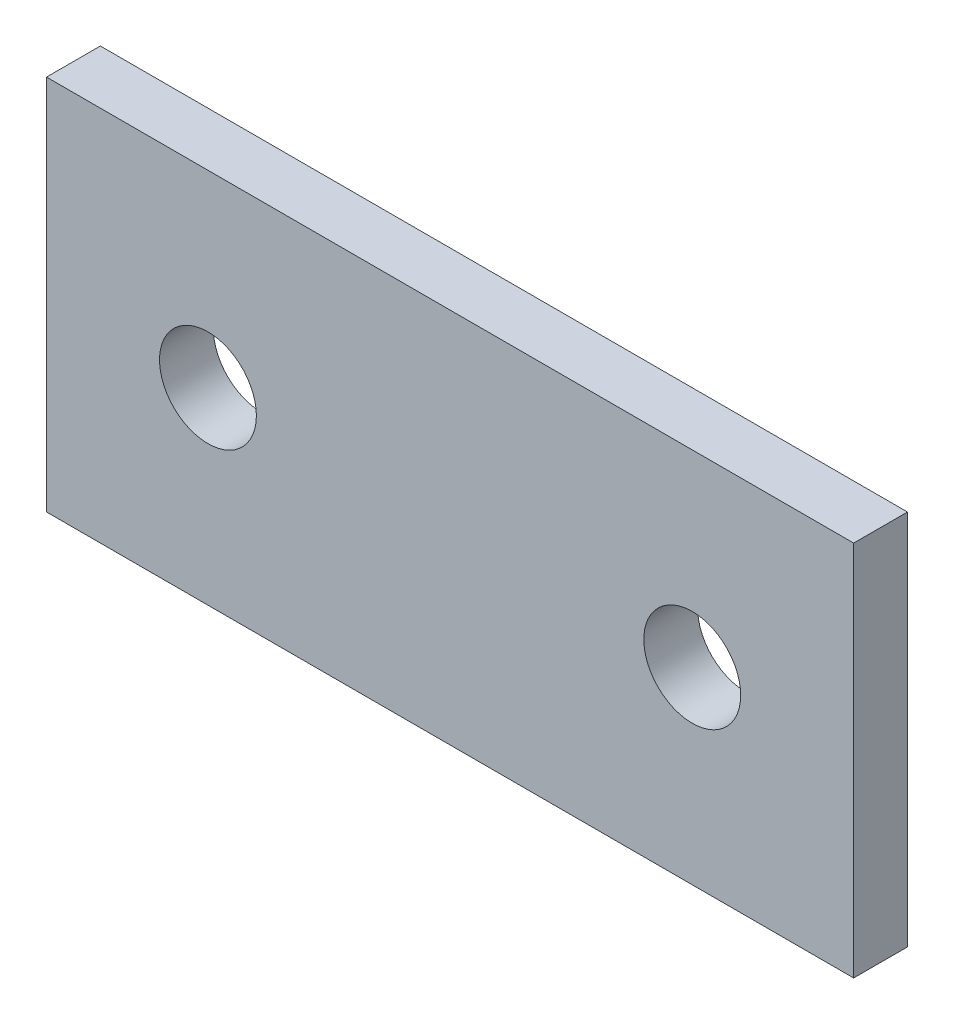
ISO-10303-21;
HEADER;
FILE_DESCRIPTION(('STEP AP214'),'2;1');
FILE_NAME('part.step','',(''),(''),'','','');
FILE_SCHEMA(('AUTOMOTIVE_DESIGN { 1 0 10303 214 1 1 1 1 }'));
ENDSEC;
DATA;
#1=APPLICATION_CONTEXT('core data for automotive mechanical design processes');
#2=APPLICATION_PROTOCOL_DEFINITION('international standard','automotive_design',2000,#1);
#3=PRODUCT_CONTEXT('',#1,'mechanical');
#4=PRODUCT('Part','Part','',(#3));
#5=PRODUCT_RELATED_PRODUCT_CATEGORY('part','',(#4));
#6=PRODUCT_DEFINITION_FORMATION('','',#4);
#7=PRODUCT_DEFINITION_CONTEXT('part definition',#1,'design');
#8=PRODUCT_DEFINITION('design','',#6,#7);
#9=PRODUCT_DEFINITION_SHAPE('','',#8);
#10=(LENGTH_UNIT() NAMED_UNIT(*) SI_UNIT(.MILLI.,.METRE.));
#11=(NAMED_UNIT(*) PLANE_ANGLE_UNIT() SI_UNIT($,.RADIAN.));
#12=(NAMED_UNIT(*) SI_UNIT($,.STERADIAN.) SOLID_ANGLE_UNIT());
#13=UNCERTAINTY_MEASURE_WITH_UNIT(LENGTH_MEASURE(1.E-05),#10,'distance_accuracy_value','');
#14=(GEOMETRIC_REPRESENTATION_CONTEXT(3) GLOBAL_UNCERTAINTY_ASSIGNED_CONTEXT((#13)) GLOBAL_UNIT_ASSIGNED_CONTEXT((#10,
#11,#12)) REPRESENTATION_CONTEXT('',''));
#15=CARTESIAN_POINT('',(0.,0.,0.));
#16=DIRECTION('',(0.,0.,1.));
#17=DIRECTION('',(1.,0.,0.));
#18=AXIS2_PLACEMENT_3D('',#15,#16,#17);
#19=CARTESIAN_POINT('',(0.,0.,5.));
#20=DIRECTION('',(0.,0.,1.));
#21=DIRECTION('',(1.,0.,0.));
#22=AXIS2_PLACEMENT_3D('',#19,#20,#21);
#23=PLANE('',#22);
#24=CARTESIAN_POINT('',(45.,0.,5.));
#25=DIRECTION('',(0.,0.,1.));
#26=DIRECTION('',(1.,0.,0.));
#27=AXIS2_PLACEMENT_3D('',#24,#25,#26);
#28=CIRCLE('',#27,9.);
#29=CARTESIAN_POINT('',(54.,0.,5.));
#30=VERTEX_POINT('',#29);
#31=EDGE_CURVE('E102',#30,#30,#28,.T.);
#32=ORIENTED_EDGE('',*,*,#31,.F.);
#33=EDGE_LOOP('',(#32));
#34=FACE_BOUND('',#33,.T.);
#35=DIRECTION('',(0.,1.,0.));
#36=VECTOR('',#35,1.);
#37=CARTESIAN_POINT('',(75.,35.,5.));
#38=LINE('',#37,#36);
#39=CARTESIAN_POINT('',(75.,-35.,5.));
#40=VERTEX_POINT('',#39);
#41=CARTESIAN_POINT('',(75.,35.,5.));
#42=VERTEX_POINT('',#41);
#43=EDGE_CURVE('E87',#40,#42,#38,.T.);
#44=ORIENTED_EDGE('',*,*,#43,.T.);
#45=DIRECTION('',(-1.,0.,0.));
#46=VECTOR('',#45,1.);
#47=CARTESIAN_POINT('',(-75.,35.,5.));
#48=LINE('',#47,#46);
#49=CARTESIAN_POINT('',(-75.,35.,5.));
#50=VERTEX_POINT('',#49);
#51=EDGE_CURVE('E82',#42,#50,#48,.T.);
#52=ORIENTED_EDGE('',*,*,#51,.T.);
#53=DIRECTION('',(0.,-1.,0.));
#54=VECTOR('',#53,1.);
#55=CARTESIAN_POINT('',(-75.,35.,5.));
#56=LINE('',#55,#54);
#57=CARTESIAN_POINT('',(-75.,-35.,5.));
#58=VERTEX_POINT('',#57);
#59=EDGE_CURVE('E85',#50,#58,#56,.T.);
#60=ORIENTED_EDGE('',*,*,#59,.T.);
#61=DIRECTION('',(1.,0.,0.));
#62=VECTOR('',#61,1.);
#63=CARTESIAN_POINT('',(-75.,-35.,5.));
#64=LINE('',#63,#62);
#65=EDGE_CURVE('E52',#58,#40,#64,.T.);
#66=ORIENTED_EDGE('',*,*,#65,.T.);
#67=EDGE_LOOP('',(#44,#52,#60,#66));
#68=FACE_BOUND('',#67,.T.);
#69=CARTESIAN_POINT('',(-45.,0.,5.));
#70=DIRECTION('',(0.,0.,1.));
#71=DIRECTION('',(1.,0.,0.));
#72=AXIS2_PLACEMENT_3D('',#69,#70,#71);
#73=CIRCLE('',#72,9.);
#74=CARTESIAN_POINT('',(-36.,0.,5.));
#75=VERTEX_POINT('',#74);
#76=EDGE_CURVE('E117',#75,#75,#73,.T.);
#77=ORIENTED_EDGE('',*,*,#76,.F.);
#78=EDGE_LOOP('',(#77));
#79=FACE_BOUND('',#78,.T.);
#80=ADVANCED_FACE('F35',(#34,#68,#79),#23,.T.);
#81=CARTESIAN_POINT('',(0.,0.,-5.));
#82=DIRECTION('',(0.,0.,1.));
#83=DIRECTION('',(1.,0.,0.));
#84=AXIS2_PLACEMENT_3D('',#81,#82,#83);
#85=PLANE('',#84);
#86=DIRECTION('',(0.,1.,0.));
#87=VECTOR('',#86,1.);
#88=CARTESIAN_POINT('',(75.,35.,-5.));
#89=LINE('',#88,#87);
#90=CARTESIAN_POINT('',(75.,-35.,-5.));
#91=VERTEX_POINT('',#90);
#92=CARTESIAN_POINT('',(75.,35.,-5.));
#93=VERTEX_POINT('',#92);
#94=EDGE_CURVE('E99',#91,#93,#89,.T.);
#95=ORIENTED_EDGE('',*,*,#94,.F.);
#96=DIRECTION('',(1.,0.,0.));
#97=VECTOR('',#96,1.);
#98=CARTESIAN_POINT('',(-75.,-35.,-5.));
#99=LINE('',#98,#97);
#100=CARTESIAN_POINT('',(-75.,-35.,-5.));
#101=VERTEX_POINT('',#100);
#102=EDGE_CURVE('E75',#101,#91,#99,.T.);
#103=ORIENTED_EDGE('',*,*,#102,.F.);
#104=DIRECTION('',(0.,-1.,0.));
#105=VECTOR('',#104,1.);
#106=CARTESIAN_POINT('',(-75.,35.,-5.));
#107=LINE('',#106,#105);
#108=CARTESIAN_POINT('',(-75.,35.,-5.));
#109=VERTEX_POINT('',#108);
#110=EDGE_CURVE('E69',#109,#101,#107,.T.);
#111=ORIENTED_EDGE('',*,*,#110,.F.);
#112=DIRECTION('',(-1.,0.,0.));
#113=VECTOR('',#112,1.);
#114=CARTESIAN_POINT('',(-75.,35.,-5.));
#115=LINE('',#114,#113);
#116=EDGE_CURVE('E91',#93,#109,#115,.T.);
#117=ORIENTED_EDGE('',*,*,#116,.F.);
#118=EDGE_LOOP('',(#95,#103,#111,#117));
#119=FACE_BOUND('',#118,.T.);
#120=CARTESIAN_POINT('',(45.,0.,-5.));
#121=DIRECTION('',(0.,0.,1.));
#122=DIRECTION('',(1.,0.,0.));
#123=AXIS2_PLACEMENT_3D('',#120,#121,#122);
#124=CIRCLE('',#123,9.);
#125=CARTESIAN_POINT('',(54.,0.,-5.));
#126=VERTEX_POINT('',#125);
#127=EDGE_CURVE('E114',#126,#126,#124,.T.);
#128=ORIENTED_EDGE('',*,*,#127,.T.);
#129=EDGE_LOOP('',(#128));
#130=FACE_BOUND('',#129,.T.);
#131=CARTESIAN_POINT('',(-45.,0.,-5.));
#132=DIRECTION('',(0.,0.,1.));
#133=DIRECTION('',(1.,0.,0.));
#134=AXIS2_PLACEMENT_3D('',#131,#132,#133);
#135=CIRCLE('',#134,9.);
#136=CARTESIAN_POINT('',(-36.,0.,-5.));
#137=VERTEX_POINT('',#136);
#138=EDGE_CURVE('E120',#137,#137,#135,.T.);
#139=ORIENTED_EDGE('',*,*,#138,.T.);
#140=EDGE_LOOP('',(#139));
#141=FACE_BOUND('',#140,.T.);
#142=ADVANCED_FACE('F110',(#119,#130,#141),#85,.F.);
#143=CARTESIAN_POINT('',(75.,35.,5.));
#144=DIRECTION('',(-1.,0.,0.));
#145=DIRECTION('',(0.,0.,1.));
#146=AXIS2_PLACEMENT_3D('',#143,#144,#145);
#147=PLANE('',#146);
#148=ORIENTED_EDGE('',*,*,#94,.T.);
#149=DIRECTION('',(0.,0.,-1.));
#150=VECTOR('',#149,1.);
#151=CARTESIAN_POINT('',(75.,35.,5.));
#152=LINE('',#151,#150);
#153=EDGE_CURVE('E11',#42,#93,#152,.T.);
#154=ORIENTED_EDGE('',*,*,#153,.F.);
#155=ORIENTED_EDGE('',*,*,#43,.F.);
#156=DIRECTION('',(0.,0.,-1.));
#157=VECTOR('',#156,1.);
#158=CARTESIAN_POINT('',(75.,-35.,5.));
#159=LINE('',#158,#157);
#160=EDGE_CURVE('E95',#40,#91,#159,.T.);
#161=ORIENTED_EDGE('',*,*,#160,.T.);
#162=EDGE_LOOP('',(#148,#154,#155,#161));
#163=FACE_BOUND('',#162,.T.);
#164=ADVANCED_FACE('F37',(#163),#147,.F.);
#165=CARTESIAN_POINT('',(-75.,35.,5.));
#166=DIRECTION('',(0.,-1.,0.));
#167=DIRECTION('',(0.,0.,-1.));
#168=AXIS2_PLACEMENT_3D('',#165,#166,#167);
#169=PLANE('',#168);
#170=ORIENTED_EDGE('',*,*,#116,.T.);
#171=DIRECTION('',(0.,0.,-1.));
#172=VECTOR('',#171,1.);
#173=CARTESIAN_POINT('',(-75.,35.,5.));
#174=LINE('',#173,#172);
#175=EDGE_CURVE('E44',#50,#109,#174,.T.);
#176=ORIENTED_EDGE('',*,*,#175,.F.);
#177=ORIENTED_EDGE('',*,*,#51,.F.);
#178=ORIENTED_EDGE('',*,*,#153,.T.);
#179=EDGE_LOOP('',(#170,#176,#177,#178));
#180=FACE_BOUND('',#179,.T.);
#181=ADVANCED_FACE('F90',(#180),#169,.F.);
#182=CARTESIAN_POINT('',(-75.,35.,5.));
#183=DIRECTION('',(1.,0.,0.));
#184=DIRECTION('',(0.,1.,0.));
#185=AXIS2_PLACEMENT_3D('',#182,#183,#184);
#186=PLANE('',#185);
#187=ORIENTED_EDGE('',*,*,#110,.T.);
#188=DIRECTION('',(0.,0.,-1.));
#189=VECTOR('',#188,1.);
#190=CARTESIAN_POINT('',(-75.,-35.,5.));
#191=LINE('',#190,#189);
#192=EDGE_CURVE('E92',#58,#101,#191,.T.);
#193=ORIENTED_EDGE('',*,*,#192,.F.);
#194=ORIENTED_EDGE('',*,*,#59,.F.);
#195=ORIENTED_EDGE('',*,*,#175,.T.);
#196=EDGE_LOOP('',(#187,#193,#194,#195));
#197=FACE_BOUND('',#196,.T.);
#198=ADVANCED_FACE('F93',(#197),#186,.F.);
#199=CARTESIAN_POINT('',(-75.,-35.,5.));
#200=DIRECTION('',(0.,1.,0.));
#201=DIRECTION('',(0.,0.,1.));
#202=AXIS2_PLACEMENT_3D('',#199,#200,#201);
#203=PLANE('',#202);
#204=ORIENTED_EDGE('',*,*,#102,.T.);
#205=ORIENTED_EDGE('',*,*,#160,.F.);
#206=ORIENTED_EDGE('',*,*,#65,.F.);
#207=ORIENTED_EDGE('',*,*,#192,.T.);
#208=EDGE_LOOP('',(#204,#205,#206,#207));
#209=FACE_BOUND('',#208,.T.);
#210=ADVANCED_FACE('F107',(#209),#203,.F.);
#211=CARTESIAN_POINT('',(45.,0.,5.));
#212=DIRECTION('',(0.,0.,-1.));
#213=DIRECTION('',(-1.,0.,0.));
#214=AXIS2_PLACEMENT_3D('',#211,#212,#213);
#215=CYLINDRICAL_SURFACE('',#214,9.);
#216=ORIENTED_EDGE('',*,*,#31,.T.);
#217=EDGE_LOOP('',(#216));
#218=FACE_BOUND('',#217,.T.);
#219=ORIENTED_EDGE('',*,*,#127,.F.);
#220=EDGE_LOOP('',(#219));
#221=FACE_BOUND('',#220,.T.);
#222=ADVANCED_FACE('F137',(#218,#221),#215,.F.);
#223=CARTESIAN_POINT('',(-45.,0.,5.));
#224=DIRECTION('',(0.,0.,-1.));
#225=DIRECTION('',(-1.,0.,0.));
#226=AXIS2_PLACEMENT_3D('',#223,#224,#225);
#227=CYLINDRICAL_SURFACE('',#226,9.);
#228=ORIENTED_EDGE('',*,*,#76,.T.);
#229=EDGE_LOOP('',(#228));
#230=FACE_BOUND('',#229,.T.);
#231=ORIENTED_EDGE('',*,*,#138,.F.);
#232=EDGE_LOOP('',(#231));
#233=FACE_BOUND('',#232,.T.);
#234=ADVANCED_FACE('F126',(#230,#233),#227,.F.);
#235=CLOSED_SHELL('',(#80,#142,#164,#181,#198,#210,#222,#234));
#236=MANIFOLD_SOLID_BREP('B2',#235);
#237=ADVANCED_BREP_SHAPE_REPRESENTATION('',(#18,#236),#14);
#238=SHAPE_DEFINITION_REPRESENTATION(#9,#237);
ENDSEC;
END-ISO-10303-21;
